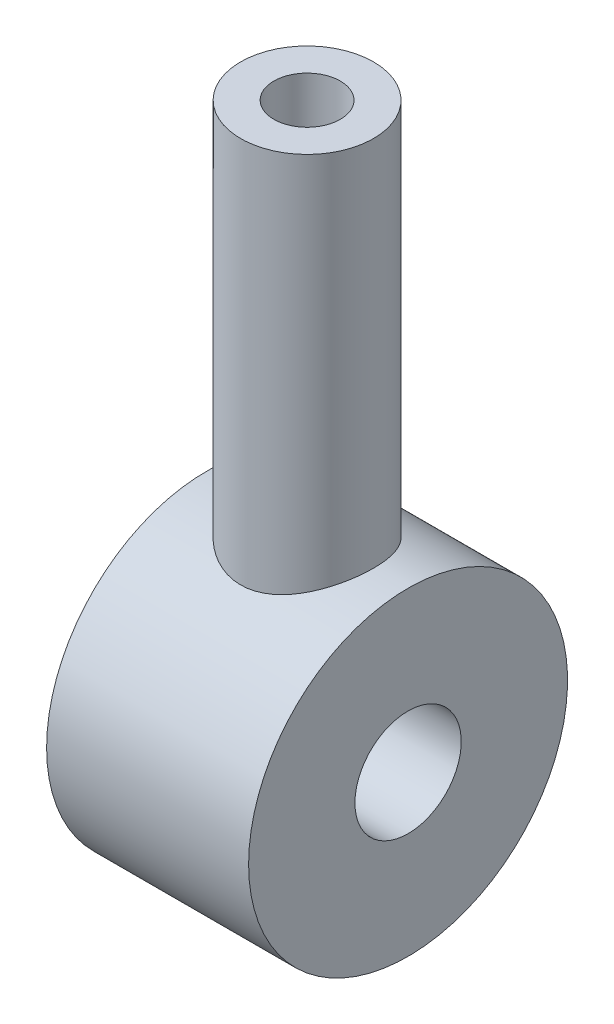
ISO-10303-21;
HEADER;
FILE_DESCRIPTION(('STEP AP214'),'2;1');
FILE_NAME('part.step','',(''),(''),'','','');
FILE_SCHEMA(('AUTOMOTIVE_DESIGN { 1 0 10303 214 1 1 1 1 }'));
ENDSEC;
DATA;
#1=APPLICATION_CONTEXT('core data for automotive mechanical design processes');
#2=APPLICATION_PROTOCOL_DEFINITION('international standard','automotive_design',2000,#1);
#3=PRODUCT_CONTEXT('',#1,'mechanical');
#4=PRODUCT('Part','Part','',(#3));
#5=PRODUCT_RELATED_PRODUCT_CATEGORY('part','',(#4));
#6=PRODUCT_DEFINITION_FORMATION('','',#4);
#7=PRODUCT_DEFINITION_CONTEXT('part definition',#1,'design');
#8=PRODUCT_DEFINITION('design','',#6,#7);
#9=PRODUCT_DEFINITION_SHAPE('','',#8);
#10=(LENGTH_UNIT() NAMED_UNIT(*) SI_UNIT(.MILLI.,.METRE.));
#11=(NAMED_UNIT(*) PLANE_ANGLE_UNIT() SI_UNIT($,.RADIAN.));
#12=(NAMED_UNIT(*) SI_UNIT($,.STERADIAN.) SOLID_ANGLE_UNIT());
#13=UNCERTAINTY_MEASURE_WITH_UNIT(LENGTH_MEASURE(1.E-05),#10,'distance_accuracy_value','');
#14=(GEOMETRIC_REPRESENTATION_CONTEXT(3) GLOBAL_UNCERTAINTY_ASSIGNED_CONTEXT((#13)) GLOBAL_UNIT_ASSIGNED_CONTEXT((#10,
#11,#12)) REPRESENTATION_CONTEXT('',''));
#15=CARTESIAN_POINT('',(0.,0.,0.));
#16=DIRECTION('',(0.,0.,1.));
#17=DIRECTION('',(1.,0.,0.));
#18=AXIS2_PLACEMENT_3D('',#15,#16,#17);
#19=CARTESIAN_POINT('',(-3.8,6.,0.));
#20=DIRECTION('',(1.,0.,0.));
#21=DIRECTION('',(0.,0.,-1.));
#22=AXIS2_PLACEMENT_3D('',#19,#20,#21);
#23=PLANE('',#22);
#24=CARTESIAN_POINT('',(-3.80000000000003,0.,0.));
#25=DIRECTION('',(-1.,0.,0.));
#26=DIRECTION('',(0.,0.,1.));
#27=AXIS2_PLACEMENT_3D('',#24,#25,#26);
#28=CIRCLE('',#27,2.);
#29=CARTESIAN_POINT('',(-3.80000000000003,0.,2.));
#30=VERTEX_POINT('',#29);
#31=EDGE_CURVE('E10',#30,#30,#28,.T.);
#32=ORIENTED_EDGE('',*,*,#31,.F.);
#33=EDGE_LOOP('',(#32));
#34=FACE_BOUND('',#33,.T.);
#35=CARTESIAN_POINT('',(-3.80000000000003,0.,0.));
#36=DIRECTION('',(-1.,0.,0.));
#37=DIRECTION('',(0.,0.,1.));
#38=AXIS2_PLACEMENT_3D('',#35,#36,#37);
#39=CIRCLE('',#38,6.);
#40=CARTESIAN_POINT('',(-3.80000000000003,0.,6.));
#41=VERTEX_POINT('',#40);
#42=EDGE_CURVE('E58',#41,#41,#39,.T.);
#43=ORIENTED_EDGE('',*,*,#42,.T.);
#44=EDGE_LOOP('',(#43));
#45=FACE_BOUND('',#44,.T.);
#46=ADVANCED_FACE('F39',(#34,#45),#23,.F.);
#47=CARTESIAN_POINT('',(-3000.,0.,0.));
#48=DIRECTION('',(-1.,0.,0.));
#49=DIRECTION('',(0.,0.,1.));
#50=AXIS2_PLACEMENT_3D('',#47,#48,#49);
#51=CYLINDRICAL_SURFACE('',#50,2.);
#52=CARTESIAN_POINT('',(3.80000000000003,0.,0.));
#53=DIRECTION('',(-1.,0.,0.));
#54=DIRECTION('',(0.,0.,1.));
#55=AXIS2_PLACEMENT_3D('',#52,#53,#54);
#56=CIRCLE('',#55,2.);
#57=CARTESIAN_POINT('',(3.80000000000003,0.,2.));
#58=VERTEX_POINT('',#57);
#59=EDGE_CURVE('E51',#58,#58,#56,.T.);
#60=ORIENTED_EDGE('',*,*,#59,.F.);
#61=EDGE_LOOP('',(#60));
#62=FACE_BOUND('',#61,.T.);
#63=ORIENTED_EDGE('',*,*,#31,.T.);
#64=EDGE_LOOP('',(#63));
#65=FACE_BOUND('',#64,.T.);
#66=ADVANCED_FACE('F82',(#62,#65),#51,.F.);
#67=CARTESIAN_POINT('',(3.8,2.,0.));
#68=DIRECTION('',(-1.,0.,0.));
#69=DIRECTION('',(0.,0.,1.));
#70=AXIS2_PLACEMENT_3D('',#67,#68,#69);
#71=PLANE('',#70);
#72=CARTESIAN_POINT('',(3.80000000000003,0.,0.));
#73=DIRECTION('',(-1.,0.,0.));
#74=DIRECTION('',(0.,0.,1.));
#75=AXIS2_PLACEMENT_3D('',#72,#73,#74);
#76=CIRCLE('',#75,6.);
#77=CARTESIAN_POINT('',(3.80000000000003,0.,6.));
#78=VERTEX_POINT('',#77);
#79=EDGE_CURVE('E54',#78,#78,#76,.T.);
#80=ORIENTED_EDGE('',*,*,#79,.F.);
#81=EDGE_LOOP('',(#80));
#82=FACE_BOUND('',#81,.T.);
#83=ORIENTED_EDGE('',*,*,#59,.T.);
#84=EDGE_LOOP('',(#83));
#85=FACE_BOUND('',#84,.T.);
#86=ADVANCED_FACE('F89',(#82,#85),#71,.F.);
#87=CARTESIAN_POINT('',(-3000.,0.,0.));
#88=DIRECTION('',(-1.,0.,0.));
#89=DIRECTION('',(0.,0.,1.));
#90=AXIS2_PLACEMENT_3D('',#87,#88,#89);
#91=CYLINDRICAL_SURFACE('',#90,6.);
#92=CARTESIAN_POINT('',(0.,5.45435605731786,-2.5));
#93=CARTESIAN_POINT('',(0.0667081831549005,5.45435734054166,-2.49999850025921));
#94=CARTESIAN_POINT('',(0.133434792168544,5.4555854329,-2.49732449538893));
#95=CARTESIAN_POINT('',(0.266386478402988,5.460451257595,-2.48666416485593));
#96=CARTESIAN_POINT('',(0.332611233895096,5.46409042196574,-2.47867468210214));
#97=CARTESIAN_POINT('',(0.530051866770563,5.47848490817198,-2.44679265931592));
#98=CARTESIAN_POINT('',(0.659836816429491,5.49271671920564,-2.41498683408238));
#99=CARTESIAN_POINT('',(0.911154764131255,5.52853615769555,-2.33180001337599));
#100=CARTESIAN_POINT('',(1.03271905209161,5.55009376241033,-2.28049881438598));
#101=CARTESIAN_POINT('',(1.26551017655699,5.59808356001864,-2.16001268934738));
#102=CARTESIAN_POINT('',(1.37673944997679,5.62451459938574,-2.09083199376537));
#103=CARTESIAN_POINT('',(1.59265398208942,5.68111508149861,-1.93194778443699));
#104=CARTESIAN_POINT('',(1.69661579704746,5.71141131571832,-1.84130648149063));
#105=CARTESIAN_POINT('',(1.88839976517447,5.77128595332676,-1.64404334636732));
#106=CARTESIAN_POINT('',(1.97621569551115,5.80086407614999,-1.53741538134828));
#107=CARTESIAN_POINT('',(2.13689925552864,5.8575107455344,-1.30552678905513));
#108=CARTESIAN_POINT('',(2.20895330788146,5.88441479600862,-1.17965858775786));
#109=CARTESIAN_POINT('',(2.33055198921748,5.93113040336416,-0.916264044334339));
#110=CARTESIAN_POINT('',(2.38010661039742,5.95094510785638,-0.778742909642265));
#111=CARTESIAN_POINT('',(2.45267893034036,5.98035041998161,-0.503536996147008));
#112=CARTESIAN_POINT('',(2.47694339323322,5.99041942231785,-0.36623315241801));
#113=CARTESIAN_POINT('',(2.50227527889198,6.00093657245546,-0.0891583607041743));
#114=CARTESIAN_POINT('',(2.50335211087423,6.00138862268061,0.0506115635357655));
#115=CARTESIAN_POINT('',(2.48293143897079,5.99290258260449,0.319585560218812));
#116=CARTESIAN_POINT('',(2.46280379917312,5.98453429295767,0.448914977212893));
#117=CARTESIAN_POINT('',(2.40289379449909,5.96013033502178,0.702165787864646));
#118=CARTESIAN_POINT('',(2.36310998067885,5.94409410149732,0.826086782110447));
#119=CARTESIAN_POINT('',(2.26454391827247,5.90559704827471,1.06727623615443));
#120=CARTESIAN_POINT('',(2.20548107427576,5.88304194251414,1.18441435414908));
#121=CARTESIAN_POINT('',(2.0703084865819,5.83371427980366,1.40742353456465));
#122=CARTESIAN_POINT('',(1.99419271830215,5.80694023334947,1.51329059551623));
#123=CARTESIAN_POINT('',(1.8208351591992,5.74963397551512,1.7186818234134));
#124=CARTESIAN_POINT('',(1.72248241745696,5.71896988702082,1.81723287462318));
#125=CARTESIAN_POINT('',(1.51057711857186,5.65875721372882,1.99686282986464));
#126=CARTESIAN_POINT('',(1.39701872336434,5.62920906299901,2.0779349916834));
#127=CARTESIAN_POINT('',(1.15320992672028,5.57363224672088,2.22280378497074));
#128=CARTESIAN_POINT('',(1.0225335886945,5.54775116967603,2.28594506698397));
#129=CARTESIAN_POINT('',(0.751037910237435,5.50419688296717,2.38892864103959));
#130=CARTESIAN_POINT('',(0.610225903515751,5.48651780631503,2.42878759251237));
#131=CARTESIAN_POINT('',(0.332206382133006,5.46282425074792,2.48160050339178));
#132=CARTESIAN_POINT('',(0.195357755471482,5.45612738403682,2.49613229266517));
#133=CARTESIAN_POINT('',(-0.078956964812587,5.45320573611839,2.50251261037213));
#134=CARTESIAN_POINT('',(-0.216422828380742,5.45697733196184,2.49436898636095));
#135=CARTESIAN_POINT('',(-0.478796770863402,5.47386262693794,2.45706955131303));
#136=CARTESIAN_POINT('',(-0.603945373574192,5.48636276033852,2.42929237636147));
#137=CARTESIAN_POINT('',(-0.847702592995153,5.51851260594277,2.355341171284));
#138=CARTESIAN_POINT('',(-0.96630967366157,5.53816398920152,2.30916284106237));
#139=CARTESIAN_POINT('',(-1.19923062071278,5.58341595714177,2.19755041610386));
#140=CARTESIAN_POINT('',(-1.31314994921936,5.60923324404617,2.13138366612393));
#141=CARTESIAN_POINT('',(-1.52881610499933,5.66360007481535,1.98240156877197));
#142=CARTESIAN_POINT('',(-1.63055763340873,5.69215079841133,1.89957901575222));
#143=CARTESIAN_POINT('',(-1.82760026976261,5.75157239569101,1.71168891143074));
#144=CARTESIAN_POINT('',(-1.92170279988034,5.78244293417774,1.6053593229584));
#145=CARTESIAN_POINT('',(-2.09094458397963,5.84086722367755,1.37770302510815));
#146=CARTESIAN_POINT('',(-2.1660824482059,5.86842073153699,1.25637521761135));
#147=CARTESIAN_POINT('',(-2.29517975080845,5.91728503171628,1.00130936160273));
#148=CARTESIAN_POINT('',(-2.34908448228483,5.93857966278875,0.867540339261894));
#149=CARTESIAN_POINT('',(-2.43323358496282,5.9723634620551,0.591717670323944));
#150=CARTESIAN_POINT('',(-2.463492037549,5.98485787035282,0.449669008506774));
#151=CARTESIAN_POINT('',(-2.49771625002042,5.9990306959926,0.172033066960381));
#152=CARTESIAN_POINT('',(-2.50337199571005,6.0014040908376,0.0366881693984323));
#153=CARTESIAN_POINT('',(-2.49277372109535,5.99699046946599,-0.23297362323924));
#154=CARTESIAN_POINT('',(-2.47652354168605,5.99020505911644,-0.367290694377478));
#155=CARTESIAN_POINT('',(-2.4237878424573,5.96860132018429,-0.626172965578198));
#156=CARTESIAN_POINT('',(-2.38804059052424,5.95407648620171,-0.750915078182086));
#157=CARTESIAN_POINT('',(-2.29813155412762,5.91858999492374,-0.992584458507239));
#158=CARTESIAN_POINT('',(-2.24396627164176,5.89762711496349,-1.1095102366691));
#159=CARTESIAN_POINT('',(-2.11602075242075,5.85011651583377,-1.33804914068053));
#160=CARTESIAN_POINT('',(-2.04146467648695,5.82335921372399,-1.44918335299799));
#161=CARTESIAN_POINT('',(-1.87598635518927,5.7674312075248,-1.65783731421916));
#162=CARTESIAN_POINT('',(-1.78505803416388,5.73825960968076,-1.75535198504112));
#163=CARTESIAN_POINT('',(-1.58210746992791,5.67829702479813,-1.9408997224229));
#164=CARTESIAN_POINT('',(-1.46907088797005,5.64753091772368,-2.02783607699356));
#165=CARTESIAN_POINT('',(-1.22909360799927,5.5899105903639,-2.18166607575475));
#166=CARTESIAN_POINT('',(-1.10214519133264,5.56305856115973,-2.24854851583746));
#167=CARTESIAN_POINT('',(-0.838071066640535,5.51685287460303,-2.35965744264203));
#168=CARTESIAN_POINT('',(-0.70100404485043,5.49745949216625,-2.40400437258696));
#169=CARTESIAN_POINT('',(-0.49083623093362,5.47594959049764,-2.45239925350778));
#170=CARTESIAN_POINT('',(-0.420089402043951,5.47004503557757,-2.46550603347808));
#171=CARTESIAN_POINT('',(-0.277573943581416,5.46095373466208,-2.48558130943928));
#172=CARTESIAN_POINT('',(-0.205806072077383,5.45776506941946,-2.49255414024397));
#173=CARTESIAN_POINT('',(-0.0892883943609653,5.45490391727668,-2.49880479670823));
#174=CARTESIAN_POINT('',(-0.0446483243266037,5.45435519844583,-2.50000100378859));
#175=CARTESIAN_POINT('',(0.,5.45435605731786,-2.5));
#176=B_SPLINE_CURVE_WITH_KNOTS('',3,(#92,#93,#94,#95,#96,#97,#98,#99,#100,#101,#102,#103,#104,
#105,#106,#107,#108,#109,#110,#111,#112,#113,#114,#115,#116,#117,#118,#119,#120,#121,#122,#123,
#124,#125,#126,#127,#128,#129,#130,#131,#132,#133,#134,#135,#136,#137,#138,#139,#140,#141,#142,
#143,#144,#145,#146,#147,#148,#149,#150,#151,#152,#153,#154,#155,#156,#157,#158,#159,#160,#161,
#162,#163,#164,#165,#166,#167,#168,#169,#170,#171,#172,#173,#174,#175),.UNSPECIFIED.,.T.,.F.,(4,
2,2,2,2,2,2,2,2,2,2,2,2,2,2,2,2,2,2,2,2,2,2,2,2,2,2,2,2,2,2,2,2,2,2,2,2,2,2,2,2,4),(0.,
0.200084575093046,0.400288095243582,0.801278994956904,1.20064597557678,1.59991854837275,
2.02172149988563,2.44368668047076,2.88395420283103,3.32402600677038,3.7411967908316,
4.15819828963116,4.54982147617441,4.94147353531022,5.33910096407386,5.73686909172223,
6.16267530816224,6.58864548009988,7.02861558463919,7.46827048625634,7.87940023747111,
8.29038772171393,8.6750626926688,9.05982760961555,9.46088720770834,9.86212068725427,
10.2960179260552,10.7299469521823,11.1649867904569,11.5997673642051,12.004157373226,
12.4084764873832,12.7984529720747,13.1885035639884,13.5961819279257,14.0040118923231,
14.4395932095167,14.8754174341574,15.3088871873109,15.5252058174741,15.7413714538654,
15.8752896716763),.UNSPECIFIED.);
#177=CARTESIAN_POINT('',(0.,5.45435605731786,-2.5));
#178=VERTEX_POINT('',#177);
#179=EDGE_CURVE('E45',#178,#178,#176,.T.);
#180=ORIENTED_EDGE('',*,*,#179,.T.);
#181=EDGE_LOOP('',(#180));
#182=FACE_BOUND('',#181,.T.);
#183=ORIENTED_EDGE('',*,*,#42,.F.);
#184=EDGE_LOOP('',(#183));
#185=FACE_BOUND('',#184,.T.);
#186=ORIENTED_EDGE('',*,*,#79,.T.);
#187=EDGE_LOOP('',(#186));
#188=FACE_BOUND('',#187,.T.);
#189=ADVANCED_FACE('F92',(#182,#185,#188),#91,.T.);
#190=CARTESIAN_POINT('',(0.,-5.,0.));
#191=DIRECTION('',(0.,-1.,0.));
#192=DIRECTION('',(0.,0.,-1.));
#193=AXIS2_PLACEMENT_3D('',#190,#191,#192);
#194=CYLINDRICAL_SURFACE('',#193,2.5);
#195=CARTESIAN_POINT('',(0.,20.,0.));
#196=DIRECTION('',(0.,-1.,0.));
#197=DIRECTION('',(0.,0.,-1.));
#198=AXIS2_PLACEMENT_3D('',#195,#196,#197);
#199=CIRCLE('',#198,2.5);
#200=CARTESIAN_POINT('',(0.,20.,-2.5));
#201=VERTEX_POINT('',#200);
#202=EDGE_CURVE('E65',#201,#201,#199,.T.);
#203=ORIENTED_EDGE('',*,*,#202,.T.);
#204=EDGE_LOOP('',(#203));
#205=FACE_BOUND('',#204,.T.);
#206=ORIENTED_EDGE('',*,*,#179,.F.);
#207=EDGE_LOOP('',(#206));
#208=FACE_BOUND('',#207,.T.);
#209=ADVANCED_FACE('F98',(#205,#208),#194,.T.);
#210=CARTESIAN_POINT('',(2.5,20.,0.));
#211=DIRECTION('',(0.,1.,0.));
#212=DIRECTION('',(0.,0.,1.));
#213=AXIS2_PLACEMENT_3D('',#210,#211,#212);
#214=PLANE('',#213);
#215=CARTESIAN_POINT('',(0.,20.,0.));
#216=DIRECTION('',(0.,-1.,0.));
#217=DIRECTION('',(0.,0.,-1.));
#218=AXIS2_PLACEMENT_3D('',#215,#216,#217);
#219=CIRCLE('',#218,1.25);
#220=CARTESIAN_POINT('',(0.,20.,-1.25));
#221=VERTEX_POINT('',#220);
#222=EDGE_CURVE('E69',#221,#221,#219,.T.);
#223=ORIENTED_EDGE('',*,*,#222,.T.);
#224=EDGE_LOOP('',(#223));
#225=FACE_BOUND('',#224,.T.);
#226=ORIENTED_EDGE('',*,*,#202,.F.);
#227=EDGE_LOOP('',(#226));
#228=FACE_BOUND('',#227,.T.);
#229=ADVANCED_FACE('F81',(#225,#228),#214,.T.);
#230=CARTESIAN_POINT('',(0.,-5.,0.));
#231=DIRECTION('',(0.,-1.,0.));
#232=DIRECTION('',(0.,0.,-1.));
#233=AXIS2_PLACEMENT_3D('',#230,#231,#232);
#234=CYLINDRICAL_SURFACE('',#233,1.25);
#235=CARTESIAN_POINT('',(0.,10.,0.));
#236=DIRECTION('',(0.,-1.,0.));
#237=DIRECTION('',(0.,0.,-1.));
#238=AXIS2_PLACEMENT_3D('',#235,#236,#237);
#239=CIRCLE('',#238,1.25);
#240=CARTESIAN_POINT('',(0.,10.,-1.25));
#241=VERTEX_POINT('',#240);
#242=EDGE_CURVE('E68',#241,#241,#239,.T.);
#243=ORIENTED_EDGE('',*,*,#242,.T.);
#244=EDGE_LOOP('',(#243));
#245=FACE_BOUND('',#244,.T.);
#246=ORIENTED_EDGE('',*,*,#222,.F.);
#247=EDGE_LOOP('',(#246));
#248=FACE_BOUND('',#247,.T.);
#249=ADVANCED_FACE('F71',(#245,#248),#234,.F.);
#250=CARTESIAN_POINT('',(1.25,10.,0.));
#251=DIRECTION('',(0.,1.,0.));
#252=DIRECTION('',(0.,0.,1.));
#253=AXIS2_PLACEMENT_3D('',#250,#251,#252);
#254=PLANE('',#253);
#255=ORIENTED_EDGE('',*,*,#242,.F.);
#256=EDGE_LOOP('',(#255));
#257=FACE_BOUND('',#256,.T.);
#258=ADVANCED_FACE('F79',(#257),#254,.T.);
#259=CLOSED_SHELL('',(#46,#66,#86,#189,#209,#229,#249,#258));
#260=MANIFOLD_SOLID_BREP('B2',#259);
#261=ADVANCED_BREP_SHAPE_REPRESENTATION('',(#18,#260),#14);
#262=SHAPE_DEFINITION_REPRESENTATION(#9,#261);
ENDSEC;
END-ISO-10303-21;
